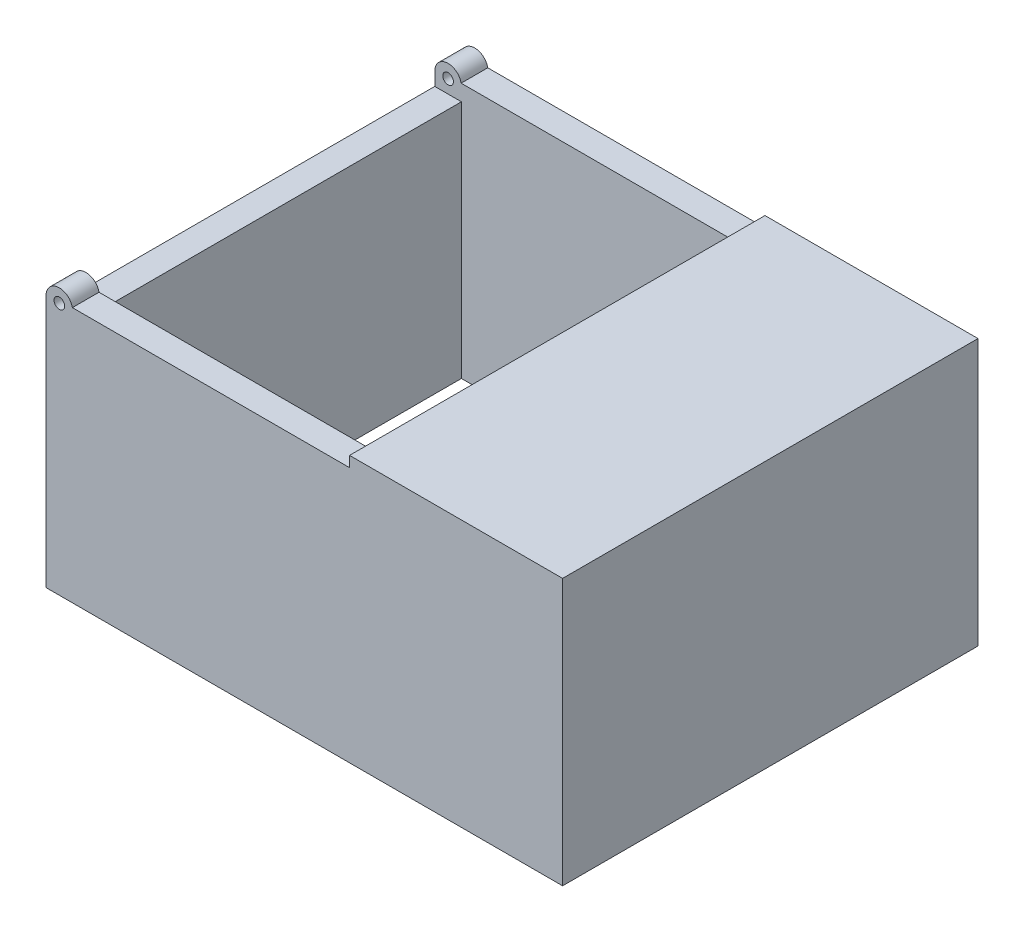
ISO-10303-21;
HEADER;
FILE_DESCRIPTION(('STEP AP214'),'2;1');
FILE_NAME('part.step','',(''),(''),'','','');
FILE_SCHEMA(('AUTOMOTIVE_DESIGN { 1 0 10303 214 1 1 1 1 }'));
ENDSEC;
DATA;
#1=APPLICATION_CONTEXT('core data for automotive mechanical design processes');
#2=APPLICATION_PROTOCOL_DEFINITION('international standard','automotive_design',2000,#1);
#3=PRODUCT_CONTEXT('',#1,'mechanical');
#4=PRODUCT('Part','Part','',(#3));
#5=PRODUCT_RELATED_PRODUCT_CATEGORY('part','',(#4));
#6=PRODUCT_DEFINITION_FORMATION('','',#4);
#7=PRODUCT_DEFINITION_CONTEXT('part definition',#1,'design');
#8=PRODUCT_DEFINITION('design','',#6,#7);
#9=PRODUCT_DEFINITION_SHAPE('','',#8);
#10=(LENGTH_UNIT() NAMED_UNIT(*) SI_UNIT(.MILLI.,.METRE.));
#11=(NAMED_UNIT(*) PLANE_ANGLE_UNIT() SI_UNIT($,.RADIAN.));
#12=(NAMED_UNIT(*) SI_UNIT($,.STERADIAN.) SOLID_ANGLE_UNIT());
#13=UNCERTAINTY_MEASURE_WITH_UNIT(LENGTH_MEASURE(1.E-05),#10,'distance_accuracy_value','');
#14=(GEOMETRIC_REPRESENTATION_CONTEXT(3) GLOBAL_UNCERTAINTY_ASSIGNED_CONTEXT((#13)) GLOBAL_UNIT_ASSIGNED_CONTEXT((#10,
#11,#12)) REPRESENTATION_CONTEXT('',''));
#15=CARTESIAN_POINT('',(0.,0.,0.));
#16=DIRECTION('',(0.,0.,1.));
#17=DIRECTION('',(1.,0.,0.));
#18=AXIS2_PLACEMENT_3D('',#15,#16,#17);
#19=CARTESIAN_POINT('',(0.,40.,167.661903789691));
#20=DIRECTION('',(0.,-1.,0.));
#21=DIRECTION('',(0.,0.,-1.));
#22=AXIS2_PLACEMENT_3D('',#19,#20,#21);
#23=PLANE('',#22);
#24=DIRECTION('',(1.,0.,0.));
#25=VECTOR('',#24,1.);
#26=CARTESIAN_POINT('',(-97.,40.,10.));
#27=LINE('',#26,#25);
#28=CARTESIAN_POINT('',(-97.,40.,10.));
#29=VERTEX_POINT('',#28);
#30=CARTESIAN_POINT('',(-87.,40.,10.));
#31=VERTEX_POINT('',#30);
#32=EDGE_CURVE('E150',#29,#31,#27,.T.);
#33=ORIENTED_EDGE('',*,*,#32,.F.);
#34=DIRECTION('',(0.,0.,-1.));
#35=VECTOR('',#34,1.);
#36=CARTESIAN_POINT('',(-97.,40.,167.661903789691));
#37=LINE('',#36,#35);
#38=CARTESIAN_POINT('',(-97.,40.,146.));
#39=VERTEX_POINT('',#38);
#40=EDGE_CURVE('E53',#39,#29,#37,.T.);
#41=ORIENTED_EDGE('',*,*,#40,.F.);
#42=DIRECTION('',(1.,0.,0.));
#43=VECTOR('',#42,1.);
#44=CARTESIAN_POINT('',(-97.,40.,146.));
#45=LINE('',#44,#43);
#46=CARTESIAN_POINT('',(-87.,40.,146.));
#47=VERTEX_POINT('',#46);
#48=EDGE_CURVE('E272',#39,#47,#45,.T.);
#49=ORIENTED_EDGE('',*,*,#48,.T.);
#50=DIRECTION('',(0.,0.,-1.));
#51=VECTOR('',#50,1.);
#52=CARTESIAN_POINT('',(-87.,40.,167.661903789691));
#53=LINE('',#52,#51);
#54=EDGE_CURVE('E158',#47,#31,#53,.T.);
#55=ORIENTED_EDGE('',*,*,#54,.T.);
#56=EDGE_LOOP('',(#33,#41,#49,#55));
#57=FACE_BOUND('',#56,.T.);
#58=ADVANCED_FACE('F38',(#57),#23,.F.);
#59=CARTESIAN_POINT('',(17.,46.,0.));
#60=DIRECTION('',(0.,-1.,0.));
#61=DIRECTION('',(0.,0.,-1.));
#62=AXIS2_PLACEMENT_3D('',#59,#60,#61);
#63=PLANE('',#62);
#64=DIRECTION('',(-1.,0.,0.));
#65=VECTOR('',#64,1.);
#66=CARTESIAN_POINT('',(-87.,46.,146.));
#67=LINE('',#66,#65);
#68=CARTESIAN_POINT('',(17.,46.,146.));
#69=VERTEX_POINT('',#68);
#70=CARTESIAN_POINT('',(-87.1010205144337,46.,146.));
#71=VERTEX_POINT('',#70);
#72=EDGE_CURVE('E190',#69,#71,#67,.T.);
#73=ORIENTED_EDGE('',*,*,#72,.T.);
#74=DIRECTION('',(0.,0.,1.));
#75=VECTOR('',#74,1.);
#76=CARTESIAN_POINT('',(-87.1010205144337,46.,146.));
#77=LINE('',#76,#75);
#78=CARTESIAN_POINT('',(-87.1010205144337,46.,156.));
#79=VERTEX_POINT('',#78);
#80=EDGE_CURVE('E171',#71,#79,#77,.T.);
#81=ORIENTED_EDGE('',*,*,#80,.T.);
#82=DIRECTION('',(1.,0.,0.));
#83=VECTOR('',#82,1.);
#84=CARTESIAN_POINT('',(17.,46.,156.));
#85=LINE('',#84,#83);
#86=CARTESIAN_POINT('',(17.,46.,156.));
#87=VERTEX_POINT('',#86);
#88=EDGE_CURVE('E177',#79,#87,#85,.T.);
#89=ORIENTED_EDGE('',*,*,#88,.T.);
#90=DIRECTION('',(0.,0.,1.));
#91=VECTOR('',#90,1.);
#92=CARTESIAN_POINT('',(17.,46.,0.));
#93=LINE('',#92,#91);
#94=EDGE_CURVE('E184',#69,#87,#93,.T.);
#95=ORIENTED_EDGE('',*,*,#94,.F.);
#96=EDGE_LOOP('',(#73,#81,#89,#95));
#97=FACE_BOUND('',#96,.T.);
#98=ADVANCED_FACE('F322',(#97),#63,.F.);
#99=DIRECTION('',(1.,0.,0.));
#100=VECTOR('',#99,1.);
#101=CARTESIAN_POINT('',(17.,46.,0.));
#102=LINE('',#101,#100);
#103=CARTESIAN_POINT('',(-87.1010205144337,46.,0.));
#104=VERTEX_POINT('',#103);
#105=CARTESIAN_POINT('',(17.,46.,0.));
#106=VERTEX_POINT('',#105);
#107=EDGE_CURVE('E182',#104,#106,#102,.T.);
#108=ORIENTED_EDGE('',*,*,#107,.F.);
#109=DIRECTION('',(0.,0.,-1.));
#110=VECTOR('',#109,1.);
#111=CARTESIAN_POINT('',(-87.1010205144337,46.,10.));
#112=LINE('',#111,#110);
#113=CARTESIAN_POINT('',(-87.1010205144337,46.,10.));
#114=VERTEX_POINT('',#113);
#115=EDGE_CURVE('E258',#114,#104,#112,.T.);
#116=ORIENTED_EDGE('',*,*,#115,.F.);
#117=DIRECTION('',(-1.,0.,0.));
#118=VECTOR('',#117,1.);
#119=CARTESIAN_POINT('',(-87.,46.,9.99999999999999));
#120=LINE('',#119,#118);
#121=CARTESIAN_POINT('',(17.,46.,10.));
#122=VERTEX_POINT('',#121);
#123=EDGE_CURVE('E188',#122,#114,#120,.T.);
#124=ORIENTED_EDGE('',*,*,#123,.F.);
#125=EDGE_CURVE('E185',#106,#122,#93,.T.);
#126=ORIENTED_EDGE('',*,*,#125,.F.);
#127=EDGE_LOOP('',(#108,#116,#124,#126));
#128=FACE_BOUND('',#127,.T.);
#129=ADVANCED_FACE('F306',(#128),#63,.F.);
#130=CARTESIAN_POINT('',(0.,50.,156.));
#131=DIRECTION('',(0.,1.,0.));
#132=DIRECTION('',(0.,0.,1.));
#133=AXIS2_PLACEMENT_3D('',#130,#131,#132);
#134=PLANE('',#133);
#135=DIRECTION('',(0.,0.,-1.));
#136=VECTOR('',#135,1.);
#137=CARTESIAN_POINT('',(17.,50.,157.180339887499));
#138=LINE('',#137,#136);
#139=CARTESIAN_POINT('',(17.,50.,156.));
#140=VERTEX_POINT('',#139);
#141=CARTESIAN_POINT('',(17.,50.,0.));
#142=VERTEX_POINT('',#141);
#143=EDGE_CURVE('E192',#140,#142,#138,.T.);
#144=ORIENTED_EDGE('',*,*,#143,.F.);
#145=DIRECTION('',(1.,0.,0.));
#146=VECTOR('',#145,1.);
#147=CARTESIAN_POINT('',(0.,50.,156.));
#148=LINE('',#147,#146);
#149=CARTESIAN_POINT('',(97.,50.,156.));
#150=VERTEX_POINT('',#149);
#151=EDGE_CURVE('E227',#140,#150,#148,.T.);
#152=ORIENTED_EDGE('',*,*,#151,.T.);
#153=DIRECTION('',(0.,0.,-1.));
#154=VECTOR('',#153,1.);
#155=CARTESIAN_POINT('',(97.,50.,156.));
#156=LINE('',#155,#154);
#157=CARTESIAN_POINT('',(97.,50.,0.));
#158=VERTEX_POINT('',#157);
#159=EDGE_CURVE('E11',#150,#158,#156,.T.);
#160=ORIENTED_EDGE('',*,*,#159,.T.);
#161=DIRECTION('',(1.,0.,0.));
#162=VECTOR('',#161,1.);
#163=CARTESIAN_POINT('',(0.,50.,0.));
#164=LINE('',#163,#162);
#165=EDGE_CURVE('E237',#142,#158,#164,.T.);
#166=ORIENTED_EDGE('',*,*,#165,.F.);
#167=EDGE_LOOP('',(#144,#152,#160,#166));
#168=FACE_BOUND('',#167,.T.);
#169=ADVANCED_FACE('F337',(#168),#134,.T.);
#170=CARTESIAN_POINT('',(0.,46.,0.));
#171=DIRECTION('',(0.,-1.,0.));
#172=DIRECTION('',(0.,0.,-1.));
#173=AXIS2_PLACEMENT_3D('',#170,#171,#172);
#174=PLANE('',#173);
#175=DIRECTION('',(1.,0.,0.));
#176=VECTOR('',#175,1.);
#177=CARTESIAN_POINT('',(-87.,46.,146.));
#178=LINE('',#177,#176);
#179=CARTESIAN_POINT('',(87.,46.,146.));
#180=VERTEX_POINT('',#179);
#181=EDGE_CURVE('E198',#69,#180,#178,.T.);
#182=ORIENTED_EDGE('',*,*,#181,.F.);
#183=DIRECTION('',(0.,0.,-1.));
#184=VECTOR('',#183,1.);
#185=CARTESIAN_POINT('',(17.,46.,0.));
#186=LINE('',#185,#184);
#187=EDGE_CURVE('E194',#69,#122,#186,.T.);
#188=ORIENTED_EDGE('',*,*,#187,.T.);
#189=DIRECTION('',(1.,0.,0.));
#190=VECTOR('',#189,1.);
#191=CARTESIAN_POINT('',(-87.,46.,9.99999999999999));
#192=LINE('',#191,#190);
#193=CARTESIAN_POINT('',(87.,46.,9.99999999999999));
#194=VERTEX_POINT('',#193);
#195=EDGE_CURVE('E204',#122,#194,#192,.T.);
#196=ORIENTED_EDGE('',*,*,#195,.T.);
#197=DIRECTION('',(0.,0.,1.));
#198=VECTOR('',#197,1.);
#199=CARTESIAN_POINT('',(87.,46.,9.99999999999999));
#200=LINE('',#199,#198);
#201=EDGE_CURVE('E200',#194,#180,#200,.T.);
#202=ORIENTED_EDGE('',*,*,#201,.T.);
#203=EDGE_LOOP('',(#182,#188,#196,#202));
#204=FACE_BOUND('',#203,.T.);
#205=ADVANCED_FACE('F301',(#204),#174,.T.);
#206=CARTESIAN_POINT('',(0.,-50.,156.));
#207=DIRECTION('',(0.,1.,0.));
#208=DIRECTION('',(0.,0.,1.));
#209=AXIS2_PLACEMENT_3D('',#206,#207,#208);
#210=PLANE('',#209);
#211=CARTESIAN_POINT('',(-92.,-50.,5.));
#212=DIRECTION('',(0.,-1.,0.));
#213=DIRECTION('',(0.,0.,-1.));
#214=AXIS2_PLACEMENT_3D('',#211,#212,#213);
#215=CIRCLE('',#214,2.);
#216=CARTESIAN_POINT('',(-92.,-50.,3.));
#217=VERTEX_POINT('',#216);
#218=EDGE_CURVE('E585',#217,#217,#215,.T.);
#219=ORIENTED_EDGE('',*,*,#218,.F.);
#220=EDGE_LOOP('',(#219));
#221=FACE_BOUND('',#220,.T.);
#222=CARTESIAN_POINT('',(92.,-50.,5.));
#223=DIRECTION('',(0.,-1.,0.));
#224=DIRECTION('',(0.,0.,-1.));
#225=AXIS2_PLACEMENT_3D('',#222,#223,#224);
#226=CIRCLE('',#225,2.);
#227=CARTESIAN_POINT('',(92.,-50.,3.00000000000001));
#228=VERTEX_POINT('',#227);
#229=EDGE_CURVE('E584',#228,#228,#226,.T.);
#230=ORIENTED_EDGE('',*,*,#229,.F.);
#231=EDGE_LOOP('',(#230));
#232=FACE_BOUND('',#231,.T.);
#233=CARTESIAN_POINT('',(92.,-50.,151.));
#234=DIRECTION('',(0.,-1.,0.));
#235=DIRECTION('',(0.,0.,-1.));
#236=AXIS2_PLACEMENT_3D('',#233,#234,#235);
#237=CIRCLE('',#236,2.);
#238=CARTESIAN_POINT('',(92.,-50.,149.));
#239=VERTEX_POINT('',#238);
#240=EDGE_CURVE('E612',#239,#239,#237,.T.);
#241=ORIENTED_EDGE('',*,*,#240,.F.);
#242=EDGE_LOOP('',(#241));
#243=FACE_BOUND('',#242,.T.);
#244=CARTESIAN_POINT('',(-92.,-50.,151.));
#245=DIRECTION('',(0.,-1.,0.));
#246=DIRECTION('',(0.,0.,-1.));
#247=AXIS2_PLACEMENT_3D('',#244,#245,#246);
#248=CIRCLE('',#247,2.);
#249=CARTESIAN_POINT('',(-92.,-50.,149.));
#250=VERTEX_POINT('',#249);
#251=EDGE_CURVE('E598',#250,#250,#248,.T.);
#252=ORIENTED_EDGE('',*,*,#251,.F.);
#253=EDGE_LOOP('',(#252));
#254=FACE_BOUND('',#253,.T.);
#255=DIRECTION('',(1.,0.,0.));
#256=VECTOR('',#255,1.);
#257=CARTESIAN_POINT('',(0.,-50.,0.));
#258=LINE('',#257,#256);
#259=CARTESIAN_POINT('',(-97.,-50.,0.));
#260=VERTEX_POINT('',#259);
#261=CARTESIAN_POINT('',(97.,-50.,0.));
#262=VERTEX_POINT('',#261);
#263=EDGE_CURVE('E228',#260,#262,#258,.T.);
#264=ORIENTED_EDGE('',*,*,#263,.T.);
#265=DIRECTION('',(0.,0.,-1.));
#266=VECTOR('',#265,1.);
#267=CARTESIAN_POINT('',(97.,-50.,156.));
#268=LINE('',#267,#266);
#269=CARTESIAN_POINT('',(97.,-50.,156.));
#270=VERTEX_POINT('',#269);
#271=EDGE_CURVE('E234',#270,#262,#268,.T.);
#272=ORIENTED_EDGE('',*,*,#271,.F.);
#273=DIRECTION('',(1.,0.,0.));
#274=VECTOR('',#273,1.);
#275=CARTESIAN_POINT('',(0.,-50.,156.));
#276=LINE('',#275,#274);
#277=CARTESIAN_POINT('',(-97.,-50.,156.));
#278=VERTEX_POINT('',#277);
#279=EDGE_CURVE('E232',#278,#270,#276,.T.);
#280=ORIENTED_EDGE('',*,*,#279,.F.);
#281=DIRECTION('',(0.,0.,-1.));
#282=VECTOR('',#281,1.);
#283=CARTESIAN_POINT('',(-97.,-50.,156.));
#284=LINE('',#283,#282);
#285=EDGE_CURVE('E46',#278,#260,#284,.T.);
#286=ORIENTED_EDGE('',*,*,#285,.T.);
#287=EDGE_LOOP('',(#264,#272,#280,#286));
#288=FACE_BOUND('',#287,.T.);
#289=DIRECTION('',(1.,0.,0.));
#290=VECTOR('',#289,1.);
#291=CARTESIAN_POINT('',(-87.,-50.,146.));
#292=LINE('',#291,#290);
#293=CARTESIAN_POINT('',(-87.,-50.,146.));
#294=VERTEX_POINT('',#293);
#295=CARTESIAN_POINT('',(87.,-50.,146.));
#296=VERTEX_POINT('',#295);
#297=EDGE_CURVE('E197',#294,#296,#292,.T.);
#298=ORIENTED_EDGE('',*,*,#297,.T.);
#299=DIRECTION('',(0.,0.,1.));
#300=VECTOR('',#299,1.);
#301=CARTESIAN_POINT('',(87.,-50.,9.99999999999999));
#302=LINE('',#301,#300);
#303=CARTESIAN_POINT('',(87.,-50.,9.99999999999999));
#304=VERTEX_POINT('',#303);
#305=EDGE_CURVE('E208',#304,#296,#302,.T.);
#306=ORIENTED_EDGE('',*,*,#305,.F.);
#307=DIRECTION('',(1.,0.,0.));
#308=VECTOR('',#307,1.);
#309=CARTESIAN_POINT('',(-87.,-50.,9.99999999999999));
#310=LINE('',#309,#308);
#311=CARTESIAN_POINT('',(-87.,-50.,9.99999999999999));
#312=VERTEX_POINT('',#311);
#313=EDGE_CURVE('E211',#312,#304,#310,.T.);
#314=ORIENTED_EDGE('',*,*,#313,.F.);
#315=DIRECTION('',(0.,0.,1.));
#316=VECTOR('',#315,1.);
#317=CARTESIAN_POINT('',(-87.,-50.,9.99999999999999));
#318=LINE('',#317,#316);
#319=EDGE_CURVE('E201',#312,#294,#318,.T.);
#320=ORIENTED_EDGE('',*,*,#319,.T.);
#321=EDGE_LOOP('',(#298,#306,#314,#320));
#322=FACE_BOUND('',#321,.T.);
#323=ADVANCED_FACE('F246',(#221,#232,#243,#254,#288,#322),#210,.F.);
#324=CARTESIAN_POINT('',(97.,0.,156.));
#325=DIRECTION('',(-1.,0.,0.));
#326=DIRECTION('',(0.,0.,1.));
#327=AXIS2_PLACEMENT_3D('',#324,#325,#326);
#328=PLANE('',#327);
#329=DIRECTION('',(0.,1.,0.));
#330=VECTOR('',#329,1.);
#331=CARTESIAN_POINT('',(97.,0.,0.));
#332=LINE('',#331,#330);
#333=EDGE_CURVE('E223',#262,#158,#332,.T.);
#334=ORIENTED_EDGE('',*,*,#333,.T.);
#335=ORIENTED_EDGE('',*,*,#159,.F.);
#336=DIRECTION('',(0.,1.,0.));
#337=VECTOR('',#336,1.);
#338=CARTESIAN_POINT('',(97.,0.,156.));
#339=LINE('',#338,#337);
#340=EDGE_CURVE('E224',#270,#150,#339,.T.);
#341=ORIENTED_EDGE('',*,*,#340,.F.);
#342=ORIENTED_EDGE('',*,*,#271,.T.);
#343=EDGE_LOOP('',(#334,#335,#341,#342));
#344=FACE_BOUND('',#343,.T.);
#345=ADVANCED_FACE('F40',(#344),#328,.F.);
#346=CARTESIAN_POINT('',(-97.,0.,156.));
#347=DIRECTION('',(-1.,0.,0.));
#348=DIRECTION('',(0.,0.,1.));
#349=AXIS2_PLACEMENT_3D('',#346,#347,#348);
#350=PLANE('',#349);
#351=DIRECTION('',(0.,1.,0.));
#352=VECTOR('',#351,1.);
#353=CARTESIAN_POINT('',(-97.,0.,156.));
#354=LINE('',#353,#352);
#355=CARTESIAN_POINT('',(-97.,45.,156.));
#356=VERTEX_POINT('',#355);
#357=EDGE_CURVE('E230',#278,#356,#354,.T.);
#358=ORIENTED_EDGE('',*,*,#357,.T.);
#359=DIRECTION('',(0.,0.,1.));
#360=VECTOR('',#359,1.);
#361=CARTESIAN_POINT('',(-97.,45.,146.));
#362=LINE('',#361,#360);
#363=CARTESIAN_POINT('',(-97.,45.,146.));
#364=VERTEX_POINT('',#363);
#365=EDGE_CURVE('E166',#364,#356,#362,.T.);
#366=ORIENTED_EDGE('',*,*,#365,.F.);
#367=DIRECTION('',(0.,-1.,0.));
#368=VECTOR('',#367,1.);
#369=CARTESIAN_POINT('',(-97.,40.,146.));
#370=LINE('',#369,#368);
#371=EDGE_CURVE('E165',#364,#39,#370,.T.);
#372=ORIENTED_EDGE('',*,*,#371,.T.);
#373=ORIENTED_EDGE('',*,*,#40,.T.);
#374=DIRECTION('',(0.,-1.,0.));
#375=VECTOR('',#374,1.);
#376=CARTESIAN_POINT('',(-97.,40.,10.));
#377=LINE('',#376,#375);
#378=CARTESIAN_POINT('',(-97.,45.,10.));
#379=VERTEX_POINT('',#378);
#380=EDGE_CURVE('E147',#379,#29,#377,.T.);
#381=ORIENTED_EDGE('',*,*,#380,.F.);
#382=DIRECTION('',(0.,0.,-1.));
#383=VECTOR('',#382,1.);
#384=CARTESIAN_POINT('',(-97.,45.,10.));
#385=LINE('',#384,#383);
#386=CARTESIAN_POINT('',(-97.,45.,0.));
#387=VERTEX_POINT('',#386);
#388=EDGE_CURVE('E256',#379,#387,#385,.T.);
#389=ORIENTED_EDGE('',*,*,#388,.T.);
#390=DIRECTION('',(0.,1.,0.));
#391=VECTOR('',#390,1.);
#392=CARTESIAN_POINT('',(-97.,0.,0.));
#393=LINE('',#392,#391);
#394=EDGE_CURVE('E239',#260,#387,#393,.T.);
#395=ORIENTED_EDGE('',*,*,#394,.F.);
#396=ORIENTED_EDGE('',*,*,#285,.F.);
#397=EDGE_LOOP('',(#358,#366,#372,#373,#381,#389,#395,#396));
#398=FACE_BOUND('',#397,.T.);
#399=ADVANCED_FACE('F163',(#398),#350,.T.);
#400=CARTESIAN_POINT('',(0.,0.,156.));
#401=DIRECTION('',(0.,0.,1.));
#402=DIRECTION('',(1.,0.,0.));
#403=AXIS2_PLACEMENT_3D('',#400,#401,#402);
#404=PLANE('',#403);
#405=CARTESIAN_POINT('',(-92.,45.,156.));
#406=DIRECTION('',(0.,0.,1.));
#407=DIRECTION('',(1.,0.,0.));
#408=AXIS2_PLACEMENT_3D('',#405,#406,#407);
#409=CIRCLE('',#408,2.);
#410=CARTESIAN_POINT('',(-90.,45.,156.));
#411=VERTEX_POINT('',#410);
#412=EDGE_CURVE('E268',#411,#411,#409,.T.);
#413=ORIENTED_EDGE('',*,*,#412,.F.);
#414=EDGE_LOOP('',(#413));
#415=FACE_BOUND('',#414,.T.);
#416=CARTESIAN_POINT('',(-92.,45.,156.));
#417=DIRECTION('',(0.,0.,1.));
#418=DIRECTION('',(1.,0.,0.));
#419=AXIS2_PLACEMENT_3D('',#416,#417,#418);
#420=CIRCLE('',#419,5.);
#421=EDGE_CURVE('E271',#79,#356,#420,.T.);
#422=ORIENTED_EDGE('',*,*,#421,.T.);
#423=ORIENTED_EDGE('',*,*,#357,.F.);
#424=ORIENTED_EDGE('',*,*,#279,.T.);
#425=ORIENTED_EDGE('',*,*,#340,.T.);
#426=ORIENTED_EDGE('',*,*,#151,.F.);
#427=DIRECTION('',(0.,1.,0.));
#428=VECTOR('',#427,1.);
#429=CARTESIAN_POINT('',(17.,50.,156.));
#430=LINE('',#429,#428);
#431=EDGE_CURVE('E168',#87,#140,#430,.T.);
#432=ORIENTED_EDGE('',*,*,#431,.F.);
#433=ORIENTED_EDGE('',*,*,#88,.F.);
#434=EDGE_LOOP('',(#422,#423,#424,#425,#426,#432,#433));
#435=FACE_BOUND('',#434,.T.);
#436=ADVANCED_FACE('F281',(#415,#435),#404,.T.);
#437=CARTESIAN_POINT('',(0.,0.,0.));
#438=DIRECTION('',(0.,0.,1.));
#439=DIRECTION('',(1.,0.,0.));
#440=AXIS2_PLACEMENT_3D('',#437,#438,#439);
#441=PLANE('',#440);
#442=CARTESIAN_POINT('',(-92.,45.,0.));
#443=DIRECTION('',(0.,0.,1.));
#444=DIRECTION('',(1.,0.,0.));
#445=AXIS2_PLACEMENT_3D('',#442,#443,#444);
#446=CIRCLE('',#445,2.);
#447=CARTESIAN_POINT('',(-90.,45.,0.));
#448=VERTEX_POINT('',#447);
#449=EDGE_CURVE('E604',#448,#448,#446,.F.);
#450=ORIENTED_EDGE('',*,*,#449,.F.);
#451=EDGE_LOOP('',(#450));
#452=FACE_BOUND('',#451,.T.);
#453=ORIENTED_EDGE('',*,*,#394,.T.);
#454=CARTESIAN_POINT('',(-92.,45.,0.));
#455=DIRECTION('',(0.,0.,1.));
#456=DIRECTION('',(1.,0.,0.));
#457=AXIS2_PLACEMENT_3D('',#454,#455,#456);
#458=CIRCLE('',#457,5.);
#459=EDGE_CURVE('E160',#104,#387,#458,.T.);
#460=ORIENTED_EDGE('',*,*,#459,.F.);
#461=ORIENTED_EDGE('',*,*,#107,.T.);
#462=DIRECTION('',(0.,1.,0.));
#463=VECTOR('',#462,1.);
#464=CARTESIAN_POINT('',(17.,50.,0.));
#465=LINE('',#464,#463);
#466=EDGE_CURVE('E179',#106,#142,#465,.T.);
#467=ORIENTED_EDGE('',*,*,#466,.T.);
#468=ORIENTED_EDGE('',*,*,#165,.T.);
#469=ORIENTED_EDGE('',*,*,#333,.F.);
#470=ORIENTED_EDGE('',*,*,#263,.F.);
#471=EDGE_LOOP('',(#453,#460,#461,#467,#468,#469,#470));
#472=FACE_BOUND('',#471,.T.);
#473=ADVANCED_FACE('F253',(#452,#472),#441,.F.);
#474=CARTESIAN_POINT('',(-87.,46.,146.));
#475=DIRECTION('',(0.,0.,-1.));
#476=DIRECTION('',(-1.,0.,0.));
#477=AXIS2_PLACEMENT_3D('',#474,#475,#476);
#478=PLANE('',#477);
#479=CARTESIAN_POINT('',(-92.,45.,146.));
#480=DIRECTION('',(0.,0.,-1.));
#481=DIRECTION('',(-1.,0.,0.));
#482=AXIS2_PLACEMENT_3D('',#479,#480,#481);
#483=CIRCLE('',#482,2.);
#484=CARTESIAN_POINT('',(-94.,45.,146.));
#485=VERTEX_POINT('',#484);
#486=EDGE_CURVE('E261',#485,#485,#483,.T.);
#487=ORIENTED_EDGE('',*,*,#486,.F.);
#488=EDGE_LOOP('',(#487));
#489=FACE_BOUND('',#488,.T.);
#490=ORIENTED_EDGE('',*,*,#72,.F.);
#491=ORIENTED_EDGE('',*,*,#181,.T.);
#492=DIRECTION('',(0.,-1.,0.));
#493=VECTOR('',#492,1.);
#494=CARTESIAN_POINT('',(87.,46.,146.));
#495=LINE('',#494,#493);
#496=EDGE_CURVE('E221',#180,#296,#495,.T.);
#497=ORIENTED_EDGE('',*,*,#496,.T.);
#498=ORIENTED_EDGE('',*,*,#297,.F.);
#499=DIRECTION('',(0.,-1.,0.));
#500=VECTOR('',#499,1.);
#501=CARTESIAN_POINT('',(-87.,46.,146.));
#502=LINE('',#501,#500);
#503=EDGE_CURVE('E61',#47,#294,#502,.T.);
#504=ORIENTED_EDGE('',*,*,#503,.F.);
#505=ORIENTED_EDGE('',*,*,#48,.F.);
#506=ORIENTED_EDGE('',*,*,#371,.F.);
#507=CARTESIAN_POINT('',(-92.,45.,146.));
#508=DIRECTION('',(0.,0.,1.));
#509=DIRECTION('',(1.,0.,0.));
#510=AXIS2_PLACEMENT_3D('',#507,#508,#509);
#511=CIRCLE('',#510,5.);
#512=EDGE_CURVE('E274',#71,#364,#511,.T.);
#513=ORIENTED_EDGE('',*,*,#512,.F.);
#514=EDGE_LOOP('',(#490,#491,#497,#498,#504,#505,#506,#513));
#515=FACE_BOUND('',#514,.T.);
#516=ADVANCED_FACE('F290',(#489,#515),#478,.T.);
#517=CARTESIAN_POINT('',(87.,46.,9.99999999999999));
#518=DIRECTION('',(1.,0.,0.));
#519=DIRECTION('',(0.,0.,-1.));
#520=AXIS2_PLACEMENT_3D('',#517,#518,#519);
#521=PLANE('',#520);
#522=ORIENTED_EDGE('',*,*,#305,.T.);
#523=ORIENTED_EDGE('',*,*,#496,.F.);
#524=ORIENTED_EDGE('',*,*,#201,.F.);
#525=DIRECTION('',(0.,-1.,0.));
#526=VECTOR('',#525,1.);
#527=CARTESIAN_POINT('',(87.,46.,9.99999999999999));
#528=LINE('',#527,#526);
#529=EDGE_CURVE('E219',#194,#304,#528,.T.);
#530=ORIENTED_EDGE('',*,*,#529,.T.);
#531=EDGE_LOOP('',(#522,#523,#524,#530));
#532=FACE_BOUND('',#531,.T.);
#533=ADVANCED_FACE('F298',(#532),#521,.F.);
#534=CARTESIAN_POINT('',(-87.,46.,9.99999999999999));
#535=DIRECTION('',(0.,0.,-1.));
#536=DIRECTION('',(-1.,0.,0.));
#537=AXIS2_PLACEMENT_3D('',#534,#535,#536);
#538=PLANE('',#537);
#539=CARTESIAN_POINT('',(-92.,45.,10.));
#540=DIRECTION('',(0.,0.,-1.));
#541=DIRECTION('',(-1.,0.,0.));
#542=AXIS2_PLACEMENT_3D('',#539,#540,#541);
#543=CIRCLE('',#542,2.);
#544=CARTESIAN_POINT('',(-94.,45.,10.));
#545=VERTEX_POINT('',#544);
#546=EDGE_CURVE('E597',#545,#545,#543,.T.);
#547=ORIENTED_EDGE('',*,*,#546,.T.);
#548=EDGE_LOOP('',(#547));
#549=FACE_BOUND('',#548,.T.);
#550=ORIENTED_EDGE('',*,*,#195,.F.);
#551=ORIENTED_EDGE('',*,*,#123,.T.);
#552=CARTESIAN_POINT('',(-92.,45.,10.));
#553=DIRECTION('',(0.,0.,1.));
#554=DIRECTION('',(1.,0.,0.));
#555=AXIS2_PLACEMENT_3D('',#552,#553,#554);
#556=CIRCLE('',#555,5.);
#557=EDGE_CURVE('E153',#114,#379,#556,.T.);
#558=ORIENTED_EDGE('',*,*,#557,.T.);
#559=ORIENTED_EDGE('',*,*,#380,.T.);
#560=ORIENTED_EDGE('',*,*,#32,.T.);
#561=DIRECTION('',(0.,-1.,0.));
#562=VECTOR('',#561,1.);
#563=CARTESIAN_POINT('',(-87.,46.,9.99999999999999));
#564=LINE('',#563,#562);
#565=EDGE_CURVE('E217',#31,#312,#564,.T.);
#566=ORIENTED_EDGE('',*,*,#565,.T.);
#567=ORIENTED_EDGE('',*,*,#313,.T.);
#568=ORIENTED_EDGE('',*,*,#529,.F.);
#569=EDGE_LOOP('',(#550,#551,#558,#559,#560,#566,#567,#568));
#570=FACE_BOUND('',#569,.T.);
#571=ADVANCED_FACE('F149',(#549,#570),#538,.F.);
#572=CARTESIAN_POINT('',(-87.,46.,9.99999999999999));
#573=DIRECTION('',(1.,0.,0.));
#574=DIRECTION('',(0.,0.,-1.));
#575=AXIS2_PLACEMENT_3D('',#572,#573,#574);
#576=PLANE('',#575);
#577=ORIENTED_EDGE('',*,*,#54,.F.);
#578=ORIENTED_EDGE('',*,*,#503,.T.);
#579=ORIENTED_EDGE('',*,*,#319,.F.);
#580=ORIENTED_EDGE('',*,*,#565,.F.);
#581=EDGE_LOOP('',(#577,#578,#579,#580));
#582=FACE_BOUND('',#581,.T.);
#583=ADVANCED_FACE('F291',(#582),#576,.T.);
#584=CARTESIAN_POINT('',(17.,50.,157.180339887499));
#585=DIRECTION('',(-1.,0.,0.));
#586=DIRECTION('',(0.,0.,1.));
#587=AXIS2_PLACEMENT_3D('',#584,#585,#586);
#588=PLANE('',#587);
#589=ORIENTED_EDGE('',*,*,#187,.F.);
#590=ORIENTED_EDGE('',*,*,#94,.T.);
#591=ORIENTED_EDGE('',*,*,#431,.T.);
#592=ORIENTED_EDGE('',*,*,#143,.T.);
#593=ORIENTED_EDGE('',*,*,#466,.F.);
#594=ORIENTED_EDGE('',*,*,#125,.T.);
#595=EDGE_LOOP('',(#589,#590,#591,#592,#593,#594));
#596=FACE_BOUND('',#595,.T.);
#597=ADVANCED_FACE('F331',(#596),#588,.T.);
#598=CARTESIAN_POINT('',(-92.,45.,146.));
#599=DIRECTION('',(0.,0.,1.));
#600=DIRECTION('',(1.,0.,0.));
#601=AXIS2_PLACEMENT_3D('',#598,#599,#600);
#602=CYLINDRICAL_SURFACE('',#601,5.);
#603=ORIENTED_EDGE('',*,*,#421,.F.);
#604=ORIENTED_EDGE('',*,*,#80,.F.);
#605=ORIENTED_EDGE('',*,*,#512,.T.);
#606=ORIENTED_EDGE('',*,*,#365,.T.);
#607=EDGE_LOOP('',(#603,#604,#605,#606));
#608=FACE_BOUND('',#607,.T.);
#609=ADVANCED_FACE('F286',(#608),#602,.T.);
#610=CARTESIAN_POINT('',(-92.,45.,242.));
#611=DIRECTION('',(0.,0.,-1.));
#612=DIRECTION('',(-1.,0.,0.));
#613=AXIS2_PLACEMENT_3D('',#610,#611,#612);
#614=CYLINDRICAL_SURFACE('',#613,2.);
#615=ORIENTED_EDGE('',*,*,#412,.T.);
#616=EDGE_LOOP('',(#615));
#617=FACE_BOUND('',#616,.T.);
#618=ORIENTED_EDGE('',*,*,#486,.T.);
#619=EDGE_LOOP('',(#618));
#620=FACE_BOUND('',#619,.T.);
#621=ADVANCED_FACE('F310',(#617,#620),#614,.F.);
#622=CARTESIAN_POINT('',(-92.,45.,10.));
#623=DIRECTION('',(0.,0.,-1.));
#624=DIRECTION('',(-1.,0.,0.));
#625=AXIS2_PLACEMENT_3D('',#622,#623,#624);
#626=CYLINDRICAL_SURFACE('',#625,5.);
#627=ORIENTED_EDGE('',*,*,#459,.T.);
#628=ORIENTED_EDGE('',*,*,#388,.F.);
#629=ORIENTED_EDGE('',*,*,#557,.F.);
#630=ORIENTED_EDGE('',*,*,#115,.T.);
#631=EDGE_LOOP('',(#627,#628,#629,#630));
#632=FACE_BOUND('',#631,.T.);
#633=ADVANCED_FACE('F307',(#632),#626,.T.);
#634=CARTESIAN_POINT('',(-92.,45.,-86.));
#635=DIRECTION('',(0.,0.,1.));
#636=DIRECTION('',(1.,0.,0.));
#637=AXIS2_PLACEMENT_3D('',#634,#635,#636);
#638=CYLINDRICAL_SURFACE('',#637,2.);
#639=ORIENTED_EDGE('',*,*,#546,.F.);
#640=EDGE_LOOP('',(#639));
#641=FACE_BOUND('',#640,.T.);
#642=ORIENTED_EDGE('',*,*,#449,.T.);
#643=EDGE_LOOP('',(#642));
#644=FACE_BOUND('',#643,.T.);
#645=ADVANCED_FACE('F309',(#641,#644),#638,.F.);
#646=CARTESIAN_POINT('',(-92.,10.,151.));
#647=DIRECTION('',(0.,-1.,0.));
#648=DIRECTION('',(0.,0.,-1.));
#649=AXIS2_PLACEMENT_3D('',#646,#647,#648);
#650=CYLINDRICAL_SURFACE('',#649,2.);
#651=CARTESIAN_POINT('',(-92.,10.,151.));
#652=DIRECTION('',(0.,-1.,0.));
#653=DIRECTION('',(0.,0.,-1.));
#654=AXIS2_PLACEMENT_3D('',#651,#652,#653);
#655=CIRCLE('',#654,2.);
#656=CARTESIAN_POINT('',(-92.,10.,149.));
#657=VERTEX_POINT('',#656);
#658=EDGE_CURVE('E594',#657,#657,#655,.T.);
#659=ORIENTED_EDGE('',*,*,#658,.F.);
#660=EDGE_LOOP('',(#659));
#661=FACE_BOUND('',#660,.T.);
#662=ORIENTED_EDGE('',*,*,#251,.T.);
#663=EDGE_LOOP('',(#662));
#664=FACE_BOUND('',#663,.T.);
#665=ADVANCED_FACE('F316',(#661,#664),#650,.F.);
#666=CARTESIAN_POINT('',(0.,10.,0.));
#667=DIRECTION('',(0.,-1.,0.));
#668=DIRECTION('',(0.,0.,-1.));
#669=AXIS2_PLACEMENT_3D('',#666,#667,#668);
#670=PLANE('',#669);
#671=ORIENTED_EDGE('',*,*,#658,.T.);
#672=EDGE_LOOP('',(#671));
#673=FACE_BOUND('',#672,.T.);
#674=ADVANCED_FACE('F507',(#673),#670,.T.);
#675=CARTESIAN_POINT('',(92.,10.,151.));
#676=DIRECTION('',(0.,-1.,0.));
#677=DIRECTION('',(0.,0.,-1.));
#678=AXIS2_PLACEMENT_3D('',#675,#676,#677);
#679=CYLINDRICAL_SURFACE('',#678,2.);
#680=CARTESIAN_POINT('',(92.,10.,151.));
#681=DIRECTION('',(0.,-1.,0.));
#682=DIRECTION('',(0.,0.,-1.));
#683=AXIS2_PLACEMENT_3D('',#680,#681,#682);
#684=CIRCLE('',#683,2.);
#685=CARTESIAN_POINT('',(92.,10.,149.));
#686=VERTEX_POINT('',#685);
#687=EDGE_CURVE('E601',#686,#686,#684,.T.);
#688=ORIENTED_EDGE('',*,*,#687,.F.);
#689=EDGE_LOOP('',(#688));
#690=FACE_BOUND('',#689,.T.);
#691=ORIENTED_EDGE('',*,*,#240,.T.);
#692=EDGE_LOOP('',(#691));
#693=FACE_BOUND('',#692,.T.);
#694=ADVANCED_FACE('F516',(#690,#693),#679,.F.);
#695=CARTESIAN_POINT('',(0.,10.,0.));
#696=DIRECTION('',(0.,-1.,0.));
#697=DIRECTION('',(0.,0.,-1.));
#698=AXIS2_PLACEMENT_3D('',#695,#696,#697);
#699=PLANE('',#698);
#700=ORIENTED_EDGE('',*,*,#687,.T.);
#701=EDGE_LOOP('',(#700));
#702=FACE_BOUND('',#701,.T.);
#703=ADVANCED_FACE('F525',(#702),#699,.T.);
#704=CARTESIAN_POINT('',(92.,10.,5.));
#705=DIRECTION('',(0.,-1.,0.));
#706=DIRECTION('',(0.,0.,-1.));
#707=AXIS2_PLACEMENT_3D('',#704,#705,#706);
#708=CYLINDRICAL_SURFACE('',#707,2.);
#709=CARTESIAN_POINT('',(92.,10.,5.));
#710=DIRECTION('',(0.,-1.,0.));
#711=DIRECTION('',(0.,0.,-1.));
#712=AXIS2_PLACEMENT_3D('',#709,#710,#711);
#713=CIRCLE('',#712,2.);
#714=CARTESIAN_POINT('',(92.,10.,3.00000000000001));
#715=VERTEX_POINT('',#714);
#716=EDGE_CURVE('E588',#715,#715,#713,.T.);
#717=ORIENTED_EDGE('',*,*,#716,.F.);
#718=EDGE_LOOP('',(#717));
#719=FACE_BOUND('',#718,.T.);
#720=ORIENTED_EDGE('',*,*,#229,.T.);
#721=EDGE_LOOP('',(#720));
#722=FACE_BOUND('',#721,.T.);
#723=ADVANCED_FACE('F534',(#719,#722),#708,.F.);
#724=CARTESIAN_POINT('',(0.,10.,0.));
#725=DIRECTION('',(0.,-1.,0.));
#726=DIRECTION('',(0.,0.,-1.));
#727=AXIS2_PLACEMENT_3D('',#724,#725,#726);
#728=PLANE('',#727);
#729=ORIENTED_EDGE('',*,*,#716,.T.);
#730=EDGE_LOOP('',(#729));
#731=FACE_BOUND('',#730,.T.);
#732=ADVANCED_FACE('F543',(#731),#728,.T.);
#733=CARTESIAN_POINT('',(-92.,10.,5.));
#734=DIRECTION('',(0.,-1.,0.));
#735=DIRECTION('',(0.,0.,-1.));
#736=AXIS2_PLACEMENT_3D('',#733,#734,#735);
#737=CYLINDRICAL_SURFACE('',#736,2.);
#738=CARTESIAN_POINT('',(-92.,10.,5.));
#739=DIRECTION('',(0.,-1.,0.));
#740=DIRECTION('',(0.,0.,-1.));
#741=AXIS2_PLACEMENT_3D('',#738,#739,#740);
#742=CIRCLE('',#741,2.);
#743=CARTESIAN_POINT('',(-92.,10.,3.));
#744=VERTEX_POINT('',#743);
#745=EDGE_CURVE('E583',#744,#744,#742,.T.);
#746=ORIENTED_EDGE('',*,*,#745,.F.);
#747=EDGE_LOOP('',(#746));
#748=FACE_BOUND('',#747,.T.);
#749=ORIENTED_EDGE('',*,*,#218,.T.);
#750=EDGE_LOOP('',(#749));
#751=FACE_BOUND('',#750,.T.);
#752=ADVANCED_FACE('F552',(#748,#751),#737,.F.);
#753=CARTESIAN_POINT('',(0.,10.,0.));
#754=DIRECTION('',(0.,-1.,0.));
#755=DIRECTION('',(0.,0.,-1.));
#756=AXIS2_PLACEMENT_3D('',#753,#754,#755);
#757=PLANE('',#756);
#758=ORIENTED_EDGE('',*,*,#745,.T.);
#759=EDGE_LOOP('',(#758));
#760=FACE_BOUND('',#759,.T.);
#761=ADVANCED_FACE('F561',(#760),#757,.T.);
#762=CLOSED_SHELL('',(#58,#98,#129,#169,#205,#323,#345,#399,#436,#473,#516,#533,#571,#583,#597,
#609,#621,#633,#645,#665,#674,#694,#703,#723,#732,#752,#761));
#763=MANIFOLD_SOLID_BREP('B2',#762);
#764=ADVANCED_BREP_SHAPE_REPRESENTATION('',(#18,#763),#14);
#765=SHAPE_DEFINITION_REPRESENTATION(#9,#764);
ENDSEC;
END-ISO-10303-21;
